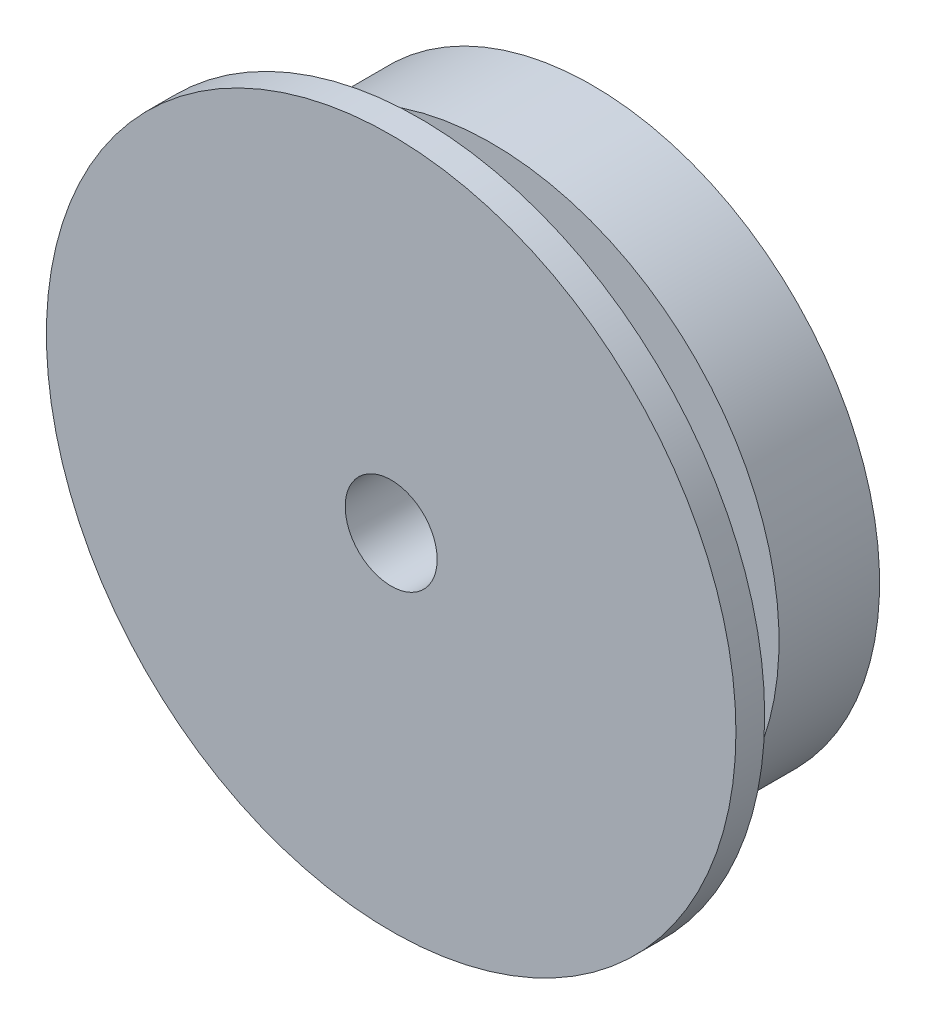
ISO-10303-21;
HEADER;
FILE_DESCRIPTION(('STEP AP214'),'2;1');
FILE_NAME('part.step','',(''),(''),'','','');
FILE_SCHEMA(('AUTOMOTIVE_DESIGN { 1 0 10303 214 1 1 1 1 }'));
ENDSEC;
DATA;
#1=APPLICATION_CONTEXT('core data for automotive mechanical design processes');
#2=APPLICATION_PROTOCOL_DEFINITION('international standard','automotive_design',2000,#1);
#3=PRODUCT_CONTEXT('',#1,'mechanical');
#4=PRODUCT('Part','Part','',(#3));
#5=PRODUCT_RELATED_PRODUCT_CATEGORY('part','',(#4));
#6=PRODUCT_DEFINITION_FORMATION('','',#4);
#7=PRODUCT_DEFINITION_CONTEXT('part definition',#1,'design');
#8=PRODUCT_DEFINITION('design','',#6,#7);
#9=PRODUCT_DEFINITION_SHAPE('','',#8);
#10=(LENGTH_UNIT() NAMED_UNIT(*) SI_UNIT(.MILLI.,.METRE.));
#11=(NAMED_UNIT(*) PLANE_ANGLE_UNIT() SI_UNIT($,.RADIAN.));
#12=(NAMED_UNIT(*) SI_UNIT($,.STERADIAN.) SOLID_ANGLE_UNIT());
#13=UNCERTAINTY_MEASURE_WITH_UNIT(LENGTH_MEASURE(1.E-05),#10,'distance_accuracy_value','');
#14=(GEOMETRIC_REPRESENTATION_CONTEXT(3) GLOBAL_UNCERTAINTY_ASSIGNED_CONTEXT((#13)) GLOBAL_UNIT_ASSIGNED_CONTEXT((#10,
#11,#12)) REPRESENTATION_CONTEXT('',''));
#15=CARTESIAN_POINT('',(0.,0.,0.));
#16=DIRECTION('',(0.,0.,1.));
#17=DIRECTION('',(1.,0.,0.));
#18=AXIS2_PLACEMENT_3D('',#15,#16,#17);
#19=CARTESIAN_POINT('',(0.,0.,0.));
#20=DIRECTION('',(0.,0.,1.));
#21=DIRECTION('',(1.,0.,0.));
#22=AXIS2_PLACEMENT_3D('',#19,#20,#21);
#23=PLANE('',#22);
#24=CARTESIAN_POINT('',(0.,0.,0.));
#25=DIRECTION('',(0.,0.,1.));
#26=DIRECTION('',(1.,0.,0.));
#27=AXIS2_PLACEMENT_3D('',#24,#25,#26);
#28=CIRCLE('',#27,6.1);
#29=CARTESIAN_POINT('',(6.1,0.,0.));
#30=VERTEX_POINT('',#29);
#31=EDGE_CURVE('E10',#30,#30,#28,.F.);
#32=ORIENTED_EDGE('',*,*,#31,.F.);
#33=EDGE_LOOP('',(#32));
#34=FACE_BOUND('',#33,.T.);
#35=CARTESIAN_POINT('',(0.,0.,0.));
#36=DIRECTION('',(0.,0.,-1.));
#37=DIRECTION('',(-1.,0.,0.));
#38=AXIS2_PLACEMENT_3D('',#35,#36,#37);
#39=CIRCLE('',#38,15.);
#40=CARTESIAN_POINT('',(-15.,0.,0.));
#41=VERTEX_POINT('',#40);
#42=EDGE_CURVE('E85',#41,#41,#39,.T.);
#43=ORIENTED_EDGE('',*,*,#42,.T.);
#44=EDGE_LOOP('',(#43));
#45=FACE_BOUND('',#44,.T.);
#46=ADVANCED_FACE('F40',(#34,#45),#23,.F.);
#47=CARTESIAN_POINT('',(0.,0.,19.));
#48=DIRECTION('',(0.,0.,-1.));
#49=DIRECTION('',(-1.,0.,0.));
#50=AXIS2_PLACEMENT_3D('',#47,#48,#49);
#51=CYLINDRICAL_SURFACE('',#50,25.);
#52=CARTESIAN_POINT('',(0.,0.,10.25));
#53=DIRECTION('',(0.,0.,-1.));
#54=DIRECTION('',(-1.,0.,0.));
#55=AXIS2_PLACEMENT_3D('',#52,#53,#54);
#56=CIRCLE('',#55,25.);
#57=CARTESIAN_POINT('',(-25.,0.,10.25));
#58=VERTEX_POINT('',#57);
#59=EDGE_CURVE('E61',#58,#58,#56,.T.);
#60=ORIENTED_EDGE('',*,*,#59,.T.);
#61=EDGE_LOOP('',(#60));
#62=FACE_BOUND('',#61,.T.);
#63=CARTESIAN_POINT('',(0.,0.,1.5));
#64=DIRECTION('',(0.,0.,-1.));
#65=DIRECTION('',(-1.,0.,0.));
#66=AXIS2_PLACEMENT_3D('',#63,#64,#65);
#67=CIRCLE('',#66,25.);
#68=CARTESIAN_POINT('',(-25.,0.,1.5));
#69=VERTEX_POINT('',#68);
#70=EDGE_CURVE('E81',#69,#69,#67,.T.);
#71=ORIENTED_EDGE('',*,*,#70,.F.);
#72=EDGE_LOOP('',(#71));
#73=FACE_BOUND('',#72,.T.);
#74=ADVANCED_FACE('F42',(#62,#73),#51,.T.);
#75=CARTESIAN_POINT('',(0.,0.,16.5));
#76=DIRECTION('',(0.,0.,1.));
#77=DIRECTION('',(1.,0.,0.));
#78=AXIS2_PLACEMENT_3D('',#75,#76,#77);
#79=CIRCLE('',#78,25.);
#80=CARTESIAN_POINT('',(25.,0.,16.5));
#81=VERTEX_POINT('',#80);
#82=EDGE_CURVE('E47',#81,#81,#79,.T.);
#83=ORIENTED_EDGE('',*,*,#82,.F.);
#84=EDGE_LOOP('',(#83));
#85=FACE_BOUND('',#84,.T.);
#86=CARTESIAN_POINT('',(0.,0.,14.25));
#87=DIRECTION('',(0.,0.,-1.));
#88=DIRECTION('',(-1.,0.,0.));
#89=AXIS2_PLACEMENT_3D('',#86,#87,#88);
#90=CIRCLE('',#89,25.);
#91=CARTESIAN_POINT('',(-25.,0.,14.25));
#92=VERTEX_POINT('',#91);
#93=EDGE_CURVE('E64',#92,#92,#90,.T.);
#94=ORIENTED_EDGE('',*,*,#93,.F.);
#95=EDGE_LOOP('',(#94));
#96=FACE_BOUND('',#95,.T.);
#97=ADVANCED_FACE('F102',(#85,#96),#51,.T.);
#98=CARTESIAN_POINT('',(0.,0.,19.));
#99=DIRECTION('',(0.,0.,1.));
#100=DIRECTION('',(1.,0.,0.));
#101=AXIS2_PLACEMENT_3D('',#98,#99,#100);
#102=PLANE('',#101);
#103=CARTESIAN_POINT('',(0.,0.,19.));
#104=DIRECTION('',(0.,0.,1.));
#105=DIRECTION('',(1.,0.,0.));
#106=AXIS2_PLACEMENT_3D('',#103,#104,#105);
#107=CIRCLE('',#106,30.);
#108=CARTESIAN_POINT('',(30.,0.,19.));
#109=VERTEX_POINT('',#108);
#110=EDGE_CURVE('E58',#109,#109,#107,.T.);
#111=ORIENTED_EDGE('',*,*,#110,.T.);
#112=EDGE_LOOP('',(#111));
#113=FACE_BOUND('',#112,.T.);
#114=CARTESIAN_POINT('',(0.,0.,19.));
#115=DIRECTION('',(0.,0.,1.));
#116=DIRECTION('',(1.,0.,0.));
#117=AXIS2_PLACEMENT_3D('',#114,#115,#116);
#118=CIRCLE('',#117,4.);
#119=CARTESIAN_POINT('',(4.,0.,19.));
#120=VERTEX_POINT('',#119);
#121=EDGE_CURVE('E51',#120,#120,#118,.T.);
#122=ORIENTED_EDGE('',*,*,#121,.F.);
#123=EDGE_LOOP('',(#122));
#124=FACE_BOUND('',#123,.T.);
#125=ADVANCED_FACE('F108',(#113,#124),#102,.T.);
#126=CARTESIAN_POINT('',(0.,0.,17.));
#127=DIRECTION('',(0.,0.,1.));
#128=DIRECTION('',(1.,0.,0.));
#129=AXIS2_PLACEMENT_3D('',#126,#127,#128);
#130=CYLINDRICAL_SURFACE('',#129,4.);
#131=ORIENTED_EDGE('',*,*,#121,.T.);
#132=EDGE_LOOP('',(#131));
#133=FACE_BOUND('',#132,.T.);
#134=CARTESIAN_POINT('',(0.,0.,-1.5));
#135=DIRECTION('',(0.,0.,-1.));
#136=DIRECTION('',(-1.,0.,0.));
#137=AXIS2_PLACEMENT_3D('',#134,#135,#136);
#138=CIRCLE('',#137,4.);
#139=CARTESIAN_POINT('',(-4.,0.,-1.5));
#140=VERTEX_POINT('',#139);
#141=EDGE_CURVE('E78',#140,#140,#138,.T.);
#142=ORIENTED_EDGE('',*,*,#141,.T.);
#143=EDGE_LOOP('',(#142));
#144=FACE_BOUND('',#143,.T.);
#145=ADVANCED_FACE('F139',(#133,#144),#130,.F.);
#146=CARTESIAN_POINT('',(0.,0.,16.5));
#147=DIRECTION('',(0.,0.,1.));
#148=DIRECTION('',(1.,0.,0.));
#149=AXIS2_PLACEMENT_3D('',#146,#147,#148);
#150=CYLINDRICAL_SURFACE('',#149,30.);
#151=CARTESIAN_POINT('',(0.,0.,16.5));
#152=DIRECTION('',(0.,0.,1.));
#153=DIRECTION('',(1.,0.,0.));
#154=AXIS2_PLACEMENT_3D('',#151,#152,#153);
#155=CIRCLE('',#154,30.);
#156=CARTESIAN_POINT('',(30.,0.,16.5));
#157=VERTEX_POINT('',#156);
#158=EDGE_CURVE('E55',#157,#157,#155,.T.);
#159=ORIENTED_EDGE('',*,*,#158,.T.);
#160=EDGE_LOOP('',(#159));
#161=FACE_BOUND('',#160,.T.);
#162=ORIENTED_EDGE('',*,*,#110,.F.);
#163=EDGE_LOOP('',(#162));
#164=FACE_BOUND('',#163,.T.);
#165=ADVANCED_FACE('F136',(#161,#164),#150,.T.);
#166=CARTESIAN_POINT('',(0.,0.,16.5));
#167=DIRECTION('',(0.,0.,1.));
#168=DIRECTION('',(1.,0.,0.));
#169=AXIS2_PLACEMENT_3D('',#166,#167,#168);
#170=PLANE('',#169);
#171=ORIENTED_EDGE('',*,*,#82,.T.);
#172=EDGE_LOOP('',(#171));
#173=FACE_BOUND('',#172,.T.);
#174=ORIENTED_EDGE('',*,*,#158,.F.);
#175=EDGE_LOOP('',(#174));
#176=FACE_BOUND('',#175,.T.);
#177=ADVANCED_FACE('F117',(#173,#176),#170,.F.);
#178=CARTESIAN_POINT('',(0.,0.,10.25));
#179=DIRECTION('',(0.,0.,-1.));
#180=DIRECTION('',(-1.,0.,0.));
#181=AXIS2_PLACEMENT_3D('',#178,#179,#180);
#182=PLANE('',#181);
#183=ORIENTED_EDGE('',*,*,#59,.F.);
#184=EDGE_LOOP('',(#183));
#185=FACE_BOUND('',#184,.T.);
#186=CARTESIAN_POINT('',(0.,0.,10.25));
#187=DIRECTION('',(0.,0.,-1.));
#188=DIRECTION('',(-1.,0.,0.));
#189=AXIS2_PLACEMENT_3D('',#186,#187,#188);
#190=CIRCLE('',#189,19.);
#191=CARTESIAN_POINT('',(-19.,0.,10.25));
#192=VERTEX_POINT('',#191);
#193=EDGE_CURVE('E67',#192,#192,#190,.T.);
#194=ORIENTED_EDGE('',*,*,#193,.T.);
#195=EDGE_LOOP('',(#194));
#196=FACE_BOUND('',#195,.T.);
#197=ADVANCED_FACE('F113',(#185,#196),#182,.F.);
#198=CARTESIAN_POINT('',(0.,0.,14.25));
#199=DIRECTION('',(0.,0.,-1.));
#200=DIRECTION('',(-1.,0.,0.));
#201=AXIS2_PLACEMENT_3D('',#198,#199,#200);
#202=PLANE('',#201);
#203=ORIENTED_EDGE('',*,*,#93,.T.);
#204=EDGE_LOOP('',(#203));
#205=FACE_BOUND('',#204,.T.);
#206=CARTESIAN_POINT('',(0.,0.,14.25));
#207=DIRECTION('',(0.,0.,-1.));
#208=DIRECTION('',(-1.,0.,0.));
#209=AXIS2_PLACEMENT_3D('',#206,#207,#208);
#210=CIRCLE('',#209,19.);
#211=CARTESIAN_POINT('',(-19.,0.,14.25));
#212=VERTEX_POINT('',#211);
#213=EDGE_CURVE('E70',#212,#212,#210,.T.);
#214=ORIENTED_EDGE('',*,*,#213,.F.);
#215=EDGE_LOOP('',(#214));
#216=FACE_BOUND('',#215,.T.);
#217=ADVANCED_FACE('F116',(#205,#216),#202,.T.);
#218=CARTESIAN_POINT('',(0.,0.,10.25));
#219=DIRECTION('',(0.,0.,1.));
#220=DIRECTION('',(1.,0.,0.));
#221=AXIS2_PLACEMENT_3D('',#218,#219,#220);
#222=CYLINDRICAL_SURFACE('',#221,19.);
#223=ORIENTED_EDGE('',*,*,#193,.F.);
#224=EDGE_LOOP('',(#223));
#225=FACE_BOUND('',#224,.T.);
#226=ORIENTED_EDGE('',*,*,#213,.T.);
#227=EDGE_LOOP('',(#226));
#228=FACE_BOUND('',#227,.T.);
#229=ADVANCED_FACE('F121',(#225,#228),#222,.T.);
#230=CARTESIAN_POINT('',(0.,0.,-1.5));
#231=DIRECTION('',(0.,0.,-1.));
#232=DIRECTION('',(-1.,0.,0.));
#233=AXIS2_PLACEMENT_3D('',#230,#231,#232);
#234=PLANE('',#233);
#235=CARTESIAN_POINT('',(0.,0.,-1.5));
#236=DIRECTION('',(0.,0.,-1.));
#237=DIRECTION('',(-1.,0.,0.));
#238=AXIS2_PLACEMENT_3D('',#235,#236,#237);
#239=CIRCLE('',#238,6.1);
#240=CARTESIAN_POINT('',(-6.1,0.,-1.5));
#241=VERTEX_POINT('',#240);
#242=EDGE_CURVE('E73',#241,#241,#239,.T.);
#243=ORIENTED_EDGE('',*,*,#242,.T.);
#244=EDGE_LOOP('',(#243));
#245=FACE_BOUND('',#244,.T.);
#246=ORIENTED_EDGE('',*,*,#141,.F.);
#247=EDGE_LOOP('',(#246));
#248=FACE_BOUND('',#247,.T.);
#249=ADVANCED_FACE('F124',(#245,#248),#234,.T.);
#250=CARTESIAN_POINT('',(0.,0.,-1.5));
#251=DIRECTION('',(0.,0.,1.));
#252=DIRECTION('',(1.,0.,0.));
#253=AXIS2_PLACEMENT_3D('',#250,#251,#252);
#254=CYLINDRICAL_SURFACE('',#253,6.1);
#255=ORIENTED_EDGE('',*,*,#242,.F.);
#256=EDGE_LOOP('',(#255));
#257=FACE_BOUND('',#256,.T.);
#258=ORIENTED_EDGE('',*,*,#31,.T.);
#259=EDGE_LOOP('',(#258));
#260=FACE_BOUND('',#259,.T.);
#261=ADVANCED_FACE('F97',(#257,#260),#254,.T.);
#262=CARTESIAN_POINT('',(0.,0.,1.5));
#263=DIRECTION('',(0.,0.,-1.));
#264=DIRECTION('',(-1.,0.,0.));
#265=AXIS2_PLACEMENT_3D('',#262,#263,#264);
#266=PLANE('',#265);
#267=CARTESIAN_POINT('',(0.,0.,1.5));
#268=DIRECTION('',(0.,0.,-1.));
#269=DIRECTION('',(-1.,0.,0.));
#270=AXIS2_PLACEMENT_3D('',#267,#268,#269);
#271=CIRCLE('',#270,15.);
#272=CARTESIAN_POINT('',(-15.,0.,1.5));
#273=VERTEX_POINT('',#272);
#274=EDGE_CURVE('E84',#273,#273,#271,.T.);
#275=ORIENTED_EDGE('',*,*,#274,.F.);
#276=EDGE_LOOP('',(#275));
#277=FACE_BOUND('',#276,.T.);
#278=ORIENTED_EDGE('',*,*,#70,.T.);
#279=EDGE_LOOP('',(#278));
#280=FACE_BOUND('',#279,.T.);
#281=ADVANCED_FACE('F94',(#277,#280),#266,.T.);
#282=CARTESIAN_POINT('',(0.,0.,1.5));
#283=DIRECTION('',(0.,0.,-1.));
#284=DIRECTION('',(-1.,0.,0.));
#285=AXIS2_PLACEMENT_3D('',#282,#283,#284);
#286=CYLINDRICAL_SURFACE('',#285,15.);
#287=ORIENTED_EDGE('',*,*,#274,.T.);
#288=EDGE_LOOP('',(#287));
#289=FACE_BOUND('',#288,.T.);
#290=ORIENTED_EDGE('',*,*,#42,.F.);
#291=EDGE_LOOP('',(#290));
#292=FACE_BOUND('',#291,.T.);
#293=ADVANCED_FACE('F91',(#289,#292),#286,.T.);
#294=CLOSED_SHELL('',(#46,#74,#97,#125,#145,#165,#177,#197,#217,#229,#249,#261,#281,#293));
#295=MANIFOLD_SOLID_BREP('B2',#294);
#296=ADVANCED_BREP_SHAPE_REPRESENTATION('',(#18,#295),#14);
#297=SHAPE_DEFINITION_REPRESENTATION(#9,#296);
ENDSEC;
END-ISO-10303-21;
